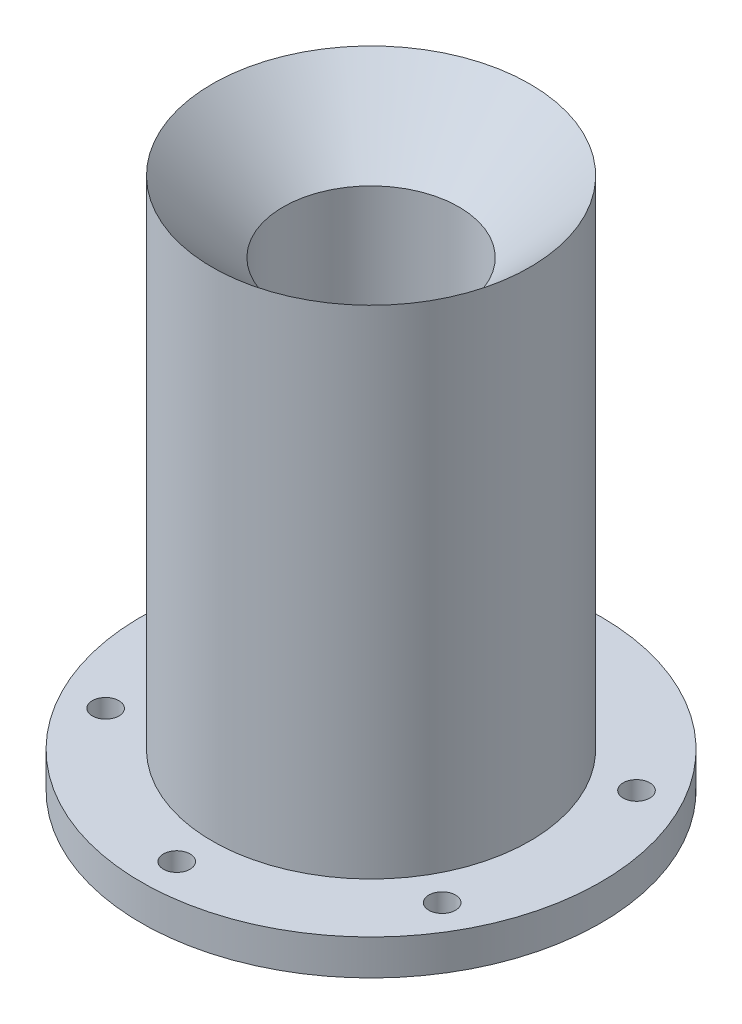
ISO-10303-21;
HEADER;
FILE_DESCRIPTION(('STEP AP214'),'2;1');
FILE_NAME('part.step','',(''),(''),'','','');
FILE_SCHEMA(('AUTOMOTIVE_DESIGN { 1 0 10303 214 1 1 1 1 }'));
ENDSEC;
DATA;
#1=APPLICATION_CONTEXT('core data for automotive mechanical design processes');
#2=APPLICATION_PROTOCOL_DEFINITION('international standard','automotive_design',2000,#1);
#3=PRODUCT_CONTEXT('',#1,'mechanical');
#4=PRODUCT('Part','Part','',(#3));
#5=PRODUCT_RELATED_PRODUCT_CATEGORY('part','',(#4));
#6=PRODUCT_DEFINITION_FORMATION('','',#4);
#7=PRODUCT_DEFINITION_CONTEXT('part definition',#1,'design');
#8=PRODUCT_DEFINITION('design','',#6,#7);
#9=PRODUCT_DEFINITION_SHAPE('','',#8);
#10=(LENGTH_UNIT() NAMED_UNIT(*) SI_UNIT(.MILLI.,.METRE.));
#11=(NAMED_UNIT(*) PLANE_ANGLE_UNIT() SI_UNIT($,.RADIAN.));
#12=(NAMED_UNIT(*) SI_UNIT($,.STERADIAN.) SOLID_ANGLE_UNIT());
#13=UNCERTAINTY_MEASURE_WITH_UNIT(LENGTH_MEASURE(1.E-05),#10,'distance_accuracy_value','');
#14=(GEOMETRIC_REPRESENTATION_CONTEXT(3) GLOBAL_UNCERTAINTY_ASSIGNED_CONTEXT((#13)) GLOBAL_UNIT_ASSIGNED_CONTEXT((#10,
#11,#12)) REPRESENTATION_CONTEXT('',''));
#15=CARTESIAN_POINT('',(0.,0.,0.));
#16=DIRECTION('',(0.,0.,1.));
#17=DIRECTION('',(1.,0.,0.));
#18=AXIS2_PLACEMENT_3D('',#15,#16,#17);
#19=CARTESIAN_POINT('',(0.,0.,0.));
#20=DIRECTION('',(0.,-1.,0.));
#21=DIRECTION('',(0.,0.,-1.));
#22=AXIS2_PLACEMENT_3D('',#19,#20,#21);
#23=CYLINDRICAL_SURFACE('',#22,25.9);
#24=CARTESIAN_POINT('',(0.,4.,0.));
#25=DIRECTION('',(0.,-1.,0.));
#26=DIRECTION('',(0.,0.,-1.));
#27=AXIS2_PLACEMENT_3D('',#24,#25,#26);
#28=CIRCLE('',#27,25.9);
#29=CARTESIAN_POINT('',(0.,4.,-25.9));
#30=VERTEX_POINT('',#29);
#31=EDGE_CURVE('E10',#30,#30,#28,.T.);
#32=ORIENTED_EDGE('',*,*,#31,.T.);
#33=EDGE_LOOP('',(#32));
#34=FACE_BOUND('',#33,.T.);
#35=CARTESIAN_POINT('',(0.,0.,0.));
#36=DIRECTION('',(0.,-1.,0.));
#37=DIRECTION('',(0.,0.,-1.));
#38=AXIS2_PLACEMENT_3D('',#35,#36,#37);
#39=CIRCLE('',#38,25.9);
#40=CARTESIAN_POINT('',(0.,0.,-25.9));
#41=VERTEX_POINT('',#40);
#42=EDGE_CURVE('E66',#41,#41,#39,.T.);
#43=ORIENTED_EDGE('',*,*,#42,.F.);
#44=EDGE_LOOP('',(#43));
#45=FACE_BOUND('',#44,.T.);
#46=ADVANCED_FACE('F33',(#34,#45),#23,.T.);
#47=CARTESIAN_POINT('',(0.,4.,-17.9));
#48=DIRECTION('',(0.,1.,0.));
#49=DIRECTION('',(0.,0.,1.));
#50=AXIS2_PLACEMENT_3D('',#47,#48,#49);
#51=PLANE('',#50);
#52=CARTESIAN_POINT('',(0.,4.,-21.9));
#53=DIRECTION('',(0.,1.,0.));
#54=DIRECTION('',(0.,0.,1.));
#55=AXIS2_PLACEMENT_3D('',#52,#53,#54);
#56=CIRCLE('',#55,1.5);
#57=CARTESIAN_POINT('',(0.,4.,-20.4));
#58=VERTEX_POINT('',#57);
#59=EDGE_CURVE('E53',#58,#58,#56,.T.);
#60=ORIENTED_EDGE('',*,*,#59,.F.);
#61=EDGE_LOOP('',(#60));
#62=FACE_BOUND('',#61,.T.);
#63=CARTESIAN_POINT('',(-18.9659563428792,4.,-10.95));
#64=DIRECTION('',(0.,1.,0.));
#65=DIRECTION('',(0.,0.,1.));
#66=AXIS2_PLACEMENT_3D('',#63,#64,#65);
#67=CIRCLE('',#66,1.5);
#68=CARTESIAN_POINT('',(-18.9659563428792,4.,-9.45));
#69=VERTEX_POINT('',#68);
#70=EDGE_CURVE('E122',#69,#69,#67,.T.);
#71=ORIENTED_EDGE('',*,*,#70,.F.);
#72=EDGE_LOOP('',(#71));
#73=FACE_BOUND('',#72,.T.);
#74=CARTESIAN_POINT('',(-18.9659563428792,4.,10.95));
#75=DIRECTION('',(0.,1.,0.));
#76=DIRECTION('',(0.,0.,1.));
#77=AXIS2_PLACEMENT_3D('',#74,#75,#76);
#78=CIRCLE('',#77,1.5);
#79=CARTESIAN_POINT('',(-18.9659563428792,4.,12.45));
#80=VERTEX_POINT('',#79);
#81=EDGE_CURVE('E78',#80,#80,#78,.T.);
#82=ORIENTED_EDGE('',*,*,#81,.F.);
#83=EDGE_LOOP('',(#82));
#84=FACE_BOUND('',#83,.T.);
#85=CARTESIAN_POINT('',(0.,4.,21.9));
#86=DIRECTION('',(0.,1.,0.));
#87=DIRECTION('',(0.,0.,1.));
#88=AXIS2_PLACEMENT_3D('',#85,#86,#87);
#89=CIRCLE('',#88,1.5);
#90=CARTESIAN_POINT('',(0.,4.,23.4));
#91=VERTEX_POINT('',#90);
#92=EDGE_CURVE('E129',#91,#91,#89,.T.);
#93=ORIENTED_EDGE('',*,*,#92,.F.);
#94=EDGE_LOOP('',(#93));
#95=FACE_BOUND('',#94,.T.);
#96=CARTESIAN_POINT('',(18.9659563428792,4.,10.95));
#97=DIRECTION('',(0.,1.,0.));
#98=DIRECTION('',(0.,0.,1.));
#99=AXIS2_PLACEMENT_3D('',#96,#97,#98);
#100=CIRCLE('',#99,1.5);
#101=CARTESIAN_POINT('',(18.9659563428792,4.,12.45));
#102=VERTEX_POINT('',#101);
#103=EDGE_CURVE('E133',#102,#102,#100,.T.);
#104=ORIENTED_EDGE('',*,*,#103,.F.);
#105=EDGE_LOOP('',(#104));
#106=FACE_BOUND('',#105,.T.);
#107=CARTESIAN_POINT('',(18.9659563428792,4.,-10.95));
#108=DIRECTION('',(0.,1.,0.));
#109=DIRECTION('',(0.,0.,1.));
#110=AXIS2_PLACEMENT_3D('',#107,#108,#109);
#111=CIRCLE('',#110,1.5);
#112=CARTESIAN_POINT('',(18.9659563428792,4.,-9.45000000000001));
#113=VERTEX_POINT('',#112);
#114=EDGE_CURVE('E137',#113,#113,#111,.T.);
#115=ORIENTED_EDGE('',*,*,#114,.F.);
#116=EDGE_LOOP('',(#115));
#117=FACE_BOUND('',#116,.T.);
#118=CARTESIAN_POINT('',(0.,4.,0.));
#119=DIRECTION('',(0.,-1.,0.));
#120=DIRECTION('',(0.,0.,-1.));
#121=AXIS2_PLACEMENT_3D('',#118,#119,#120);
#122=CIRCLE('',#121,17.9);
#123=CARTESIAN_POINT('',(0.,4.,-17.9));
#124=VERTEX_POINT('',#123);
#125=EDGE_CURVE('E40',#124,#124,#122,.T.);
#126=ORIENTED_EDGE('',*,*,#125,.T.);
#127=EDGE_LOOP('',(#126));
#128=FACE_BOUND('',#127,.T.);
#129=ORIENTED_EDGE('',*,*,#31,.F.);
#130=EDGE_LOOP('',(#129));
#131=FACE_BOUND('',#130,.T.);
#132=ADVANCED_FACE('F106',(#62,#73,#84,#95,#106,#117,#128,#131),#51,.T.);
#133=CARTESIAN_POINT('',(0.,0.,0.));
#134=DIRECTION('',(0.,-1.,0.));
#135=DIRECTION('',(0.,0.,-1.));
#136=AXIS2_PLACEMENT_3D('',#133,#134,#135);
#137=CYLINDRICAL_SURFACE('',#136,17.9);
#138=CARTESIAN_POINT('',(0.,60.,0.));
#139=DIRECTION('',(0.,-1.,0.));
#140=DIRECTION('',(0.,0.,-1.));
#141=AXIS2_PLACEMENT_3D('',#138,#139,#140);
#142=CIRCLE('',#141,17.9);
#143=CARTESIAN_POINT('',(0.,60.,-17.9));
#144=VERTEX_POINT('',#143);
#145=EDGE_CURVE('E45',#144,#144,#142,.T.);
#146=ORIENTED_EDGE('',*,*,#145,.T.);
#147=EDGE_LOOP('',(#146));
#148=FACE_BOUND('',#147,.T.);
#149=ORIENTED_EDGE('',*,*,#125,.F.);
#150=EDGE_LOOP('',(#149));
#151=FACE_BOUND('',#150,.T.);
#152=ADVANCED_FACE('F91',(#148,#151),#137,.T.);
#153=CARTESIAN_POINT('',(0.,60.,0.));
#154=DIRECTION('',(0.,1.,0.));
#155=DIRECTION('',(0.,0.,1.));
#156=AXIS2_PLACEMENT_3D('',#153,#154,#155);
#157=CONICAL_SURFACE('',#156,17.9,0.78539816339745);
#158=CARTESIAN_POINT('',(0.,52.,0.));
#159=DIRECTION('',(0.,-1.,0.));
#160=DIRECTION('',(0.,0.,-1.));
#161=AXIS2_PLACEMENT_3D('',#158,#159,#160);
#162=CIRCLE('',#161,9.9);
#163=CARTESIAN_POINT('',(0.,52.,-9.9));
#164=VERTEX_POINT('',#163);
#165=EDGE_CURVE('E86',#164,#164,#162,.T.);
#166=ORIENTED_EDGE('',*,*,#165,.T.);
#167=EDGE_LOOP('',(#166));
#168=FACE_BOUND('',#167,.T.);
#169=ORIENTED_EDGE('',*,*,#145,.F.);
#170=EDGE_LOOP('',(#169));
#171=FACE_BOUND('',#170,.T.);
#172=ADVANCED_FACE('F94',(#168,#171),#157,.F.);
#173=CARTESIAN_POINT('',(0.,0.,0.));
#174=DIRECTION('',(0.,-1.,0.));
#175=DIRECTION('',(0.,0.,-1.));
#176=AXIS2_PLACEMENT_3D('',#173,#174,#175);
#177=CYLINDRICAL_SURFACE('',#176,9.9);
#178=CARTESIAN_POINT('',(0.,2.,0.));
#179=DIRECTION('',(0.,-1.,0.));
#180=DIRECTION('',(0.,0.,-1.));
#181=AXIS2_PLACEMENT_3D('',#178,#179,#180);
#182=CIRCLE('',#181,9.90000000000001);
#183=CARTESIAN_POINT('',(0.,2.,-9.90000000000001));
#184=VERTEX_POINT('',#183);
#185=EDGE_CURVE('E83',#184,#184,#182,.T.);
#186=ORIENTED_EDGE('',*,*,#185,.T.);
#187=EDGE_LOOP('',(#186));
#188=FACE_BOUND('',#187,.T.);
#189=ORIENTED_EDGE('',*,*,#165,.F.);
#190=EDGE_LOOP('',(#189));
#191=FACE_BOUND('',#190,.T.);
#192=ADVANCED_FACE('F96',(#188,#191),#177,.F.);
#193=CARTESIAN_POINT('',(0.,2.,-9.90000000000001));
#194=DIRECTION('',(0.,-1.,0.));
#195=DIRECTION('',(0.,0.,-1.));
#196=AXIS2_PLACEMENT_3D('',#193,#194,#195);
#197=PLANE('',#196);
#198=CARTESIAN_POINT('',(0.,2.,0.));
#199=DIRECTION('',(0.,-1.,0.));
#200=DIRECTION('',(0.,0.,-1.));
#201=AXIS2_PLACEMENT_3D('',#198,#199,#200);
#202=CIRCLE('',#201,15.);
#203=CARTESIAN_POINT('',(0.,2.,-15.));
#204=VERTEX_POINT('',#203);
#205=EDGE_CURVE('E75',#204,#204,#202,.T.);
#206=ORIENTED_EDGE('',*,*,#205,.T.);
#207=EDGE_LOOP('',(#206));
#208=FACE_BOUND('',#207,.T.);
#209=ORIENTED_EDGE('',*,*,#185,.F.);
#210=EDGE_LOOP('',(#209));
#211=FACE_BOUND('',#210,.T.);
#212=ADVANCED_FACE('F103',(#208,#211),#197,.T.);
#213=CARTESIAN_POINT('',(0.,0.,0.));
#214=DIRECTION('',(0.,-1.,0.));
#215=DIRECTION('',(0.,0.,-1.));
#216=AXIS2_PLACEMENT_3D('',#213,#214,#215);
#217=CYLINDRICAL_SURFACE('',#216,15.);
#218=CARTESIAN_POINT('',(0.,0.,0.));
#219=DIRECTION('',(0.,-1.,0.));
#220=DIRECTION('',(0.,0.,-1.));
#221=AXIS2_PLACEMENT_3D('',#218,#219,#220);
#222=CIRCLE('',#221,15.);
#223=CARTESIAN_POINT('',(0.,0.,-15.));
#224=VERTEX_POINT('',#223);
#225=EDGE_CURVE('E70',#224,#224,#222,.T.);
#226=ORIENTED_EDGE('',*,*,#225,.T.);
#227=EDGE_LOOP('',(#226));
#228=FACE_BOUND('',#227,.T.);
#229=ORIENTED_EDGE('',*,*,#205,.F.);
#230=EDGE_LOOP('',(#229));
#231=FACE_BOUND('',#230,.T.);
#232=ADVANCED_FACE('F176',(#228,#231),#217,.F.);
#233=CARTESIAN_POINT('',(0.,0.,-15.));
#234=DIRECTION('',(0.,-1.,0.));
#235=DIRECTION('',(0.,0.,-1.));
#236=AXIS2_PLACEMENT_3D('',#233,#234,#235);
#237=PLANE('',#236);
#238=CARTESIAN_POINT('',(0.,0.,-21.9));
#239=DIRECTION('',(0.,-1.,0.));
#240=DIRECTION('',(0.,0.,-1.));
#241=AXIS2_PLACEMENT_3D('',#238,#239,#240);
#242=CIRCLE('',#241,1.5);
#243=CARTESIAN_POINT('',(0.,0.,-23.4));
#244=VERTEX_POINT('',#243);
#245=EDGE_CURVE('E36',#244,#244,#242,.T.);
#246=ORIENTED_EDGE('',*,*,#245,.F.);
#247=EDGE_LOOP('',(#246));
#248=FACE_BOUND('',#247,.T.);
#249=CARTESIAN_POINT('',(-18.9659563428792,0.,-10.95));
#250=DIRECTION('',(0.,-1.,0.));
#251=DIRECTION('',(0.,0.,-1.));
#252=AXIS2_PLACEMENT_3D('',#249,#250,#251);
#253=CIRCLE('',#252,1.5);
#254=CARTESIAN_POINT('',(-18.9659563428792,0.,-12.45));
#255=VERTEX_POINT('',#254);
#256=EDGE_CURVE('E61',#255,#255,#253,.T.);
#257=ORIENTED_EDGE('',*,*,#256,.F.);
#258=EDGE_LOOP('',(#257));
#259=FACE_BOUND('',#258,.T.);
#260=CARTESIAN_POINT('',(-18.9659563428792,0.,10.95));
#261=DIRECTION('',(0.,-1.,0.));
#262=DIRECTION('',(0.,0.,-1.));
#263=AXIS2_PLACEMENT_3D('',#260,#261,#262);
#264=CIRCLE('',#263,1.5);
#265=CARTESIAN_POINT('',(-18.9659563428792,0.,9.45000000000001));
#266=VERTEX_POINT('',#265);
#267=EDGE_CURVE('E59',#266,#266,#264,.T.);
#268=ORIENTED_EDGE('',*,*,#267,.F.);
#269=EDGE_LOOP('',(#268));
#270=FACE_BOUND('',#269,.T.);
#271=CARTESIAN_POINT('',(0.,0.,21.9));
#272=DIRECTION('',(0.,-1.,0.));
#273=DIRECTION('',(0.,0.,-1.));
#274=AXIS2_PLACEMENT_3D('',#271,#272,#273);
#275=CIRCLE('',#274,1.5);
#276=CARTESIAN_POINT('',(0.,0.,20.4));
#277=VERTEX_POINT('',#276);
#278=EDGE_CURVE('E56',#277,#277,#275,.T.);
#279=ORIENTED_EDGE('',*,*,#278,.F.);
#280=EDGE_LOOP('',(#279));
#281=FACE_BOUND('',#280,.T.);
#282=CARTESIAN_POINT('',(18.9659563428792,0.,10.95));
#283=DIRECTION('',(0.,-1.,0.));
#284=DIRECTION('',(0.,0.,-1.));
#285=AXIS2_PLACEMENT_3D('',#282,#283,#284);
#286=CIRCLE('',#285,1.5);
#287=CARTESIAN_POINT('',(18.9659563428792,0.,9.45));
#288=VERTEX_POINT('',#287);
#289=EDGE_CURVE('E52',#288,#288,#286,.T.);
#290=ORIENTED_EDGE('',*,*,#289,.F.);
#291=EDGE_LOOP('',(#290));
#292=FACE_BOUND('',#291,.T.);
#293=CARTESIAN_POINT('',(18.9659563428792,0.,-10.95));
#294=DIRECTION('',(0.,-1.,0.));
#295=DIRECTION('',(0.,0.,-1.));
#296=AXIS2_PLACEMENT_3D('',#293,#294,#295);
#297=CIRCLE('',#296,1.5);
#298=CARTESIAN_POINT('',(18.9659563428792,0.,-12.45));
#299=VERTEX_POINT('',#298);
#300=EDGE_CURVE('E49',#299,#299,#297,.T.);
#301=ORIENTED_EDGE('',*,*,#300,.F.);
#302=EDGE_LOOP('',(#301));
#303=FACE_BOUND('',#302,.T.);
#304=ORIENTED_EDGE('',*,*,#42,.T.);
#305=EDGE_LOOP('',(#304));
#306=FACE_BOUND('',#305,.T.);
#307=ORIENTED_EDGE('',*,*,#225,.F.);
#308=EDGE_LOOP('',(#307));
#309=FACE_BOUND('',#308,.T.);
#310=ADVANCED_FACE('F166',(#248,#259,#270,#281,#292,#303,#306,#309),#237,.T.);
#311=CARTESIAN_POINT('',(18.9659563428792,-6.,-10.95));
#312=DIRECTION('',(0.,1.,0.));
#313=DIRECTION('',(0.,0.,1.));
#314=AXIS2_PLACEMENT_3D('',#311,#312,#313);
#315=CYLINDRICAL_SURFACE('',#314,1.5);
#316=ORIENTED_EDGE('',*,*,#300,.T.);
#317=EDGE_LOOP('',(#316));
#318=FACE_BOUND('',#317,.T.);
#319=ORIENTED_EDGE('',*,*,#114,.T.);
#320=EDGE_LOOP('',(#319));
#321=FACE_BOUND('',#320,.T.);
#322=ADVANCED_FACE('F162',(#318,#321),#315,.F.);
#323=CARTESIAN_POINT('',(18.9659563428792,-6.,10.95));
#324=DIRECTION('',(0.,1.,0.));
#325=DIRECTION('',(0.,0.,1.));
#326=AXIS2_PLACEMENT_3D('',#323,#324,#325);
#327=CYLINDRICAL_SURFACE('',#326,1.5);
#328=ORIENTED_EDGE('',*,*,#289,.T.);
#329=EDGE_LOOP('',(#328));
#330=FACE_BOUND('',#329,.T.);
#331=ORIENTED_EDGE('',*,*,#103,.T.);
#332=EDGE_LOOP('',(#331));
#333=FACE_BOUND('',#332,.T.);
#334=ADVANCED_FACE('F165',(#330,#333),#327,.F.);
#335=CARTESIAN_POINT('',(0.,-6.,21.9));
#336=DIRECTION('',(0.,1.,0.));
#337=DIRECTION('',(0.,0.,1.));
#338=AXIS2_PLACEMENT_3D('',#335,#336,#337);
#339=CYLINDRICAL_SURFACE('',#338,1.5);
#340=ORIENTED_EDGE('',*,*,#278,.T.);
#341=EDGE_LOOP('',(#340));
#342=FACE_BOUND('',#341,.T.);
#343=ORIENTED_EDGE('',*,*,#92,.T.);
#344=EDGE_LOOP('',(#343));
#345=FACE_BOUND('',#344,.T.);
#346=ADVANCED_FACE('F158',(#342,#345),#339,.F.);
#347=CARTESIAN_POINT('',(-18.9659563428792,-6.,10.95));
#348=DIRECTION('',(0.,1.,0.));
#349=DIRECTION('',(0.,0.,1.));
#350=AXIS2_PLACEMENT_3D('',#347,#348,#349);
#351=CYLINDRICAL_SURFACE('',#350,1.5);
#352=ORIENTED_EDGE('',*,*,#267,.T.);
#353=EDGE_LOOP('',(#352));
#354=FACE_BOUND('',#353,.T.);
#355=ORIENTED_EDGE('',*,*,#81,.T.);
#356=EDGE_LOOP('',(#355));
#357=FACE_BOUND('',#356,.T.);
#358=ADVANCED_FACE('F151',(#354,#357),#351,.F.);
#359=CARTESIAN_POINT('',(-18.9659563428792,-6.,-10.95));
#360=DIRECTION('',(0.,1.,0.));
#361=DIRECTION('',(0.,0.,1.));
#362=AXIS2_PLACEMENT_3D('',#359,#360,#361);
#363=CYLINDRICAL_SURFACE('',#362,1.5);
#364=ORIENTED_EDGE('',*,*,#256,.T.);
#365=EDGE_LOOP('',(#364));
#366=FACE_BOUND('',#365,.T.);
#367=ORIENTED_EDGE('',*,*,#70,.T.);
#368=EDGE_LOOP('',(#367));
#369=FACE_BOUND('',#368,.T.);
#370=ADVANCED_FACE('F148',(#366,#369),#363,.F.);
#371=CARTESIAN_POINT('',(0.,-6.,-21.9));
#372=DIRECTION('',(0.,1.,0.));
#373=DIRECTION('',(0.,0.,1.));
#374=AXIS2_PLACEMENT_3D('',#371,#372,#373);
#375=CYLINDRICAL_SURFACE('',#374,1.5);
#376=ORIENTED_EDGE('',*,*,#245,.T.);
#377=EDGE_LOOP('',(#376));
#378=FACE_BOUND('',#377,.T.);
#379=ORIENTED_EDGE('',*,*,#59,.T.);
#380=EDGE_LOOP('',(#379));
#381=FACE_BOUND('',#380,.T.);
#382=ADVANCED_FACE('F150',(#378,#381),#375,.F.);
#383=CLOSED_SHELL('',(#46,#132,#152,#172,#192,#212,#232,#310,#322,#334,#346,#358,#370,#382));
#384=MANIFOLD_SOLID_BREP('B2',#383);
#385=ADVANCED_BREP_SHAPE_REPRESENTATION('',(#18,#384),#14);
#386=SHAPE_DEFINITION_REPRESENTATION(#9,#385);
ENDSEC;
END-ISO-10303-21;
